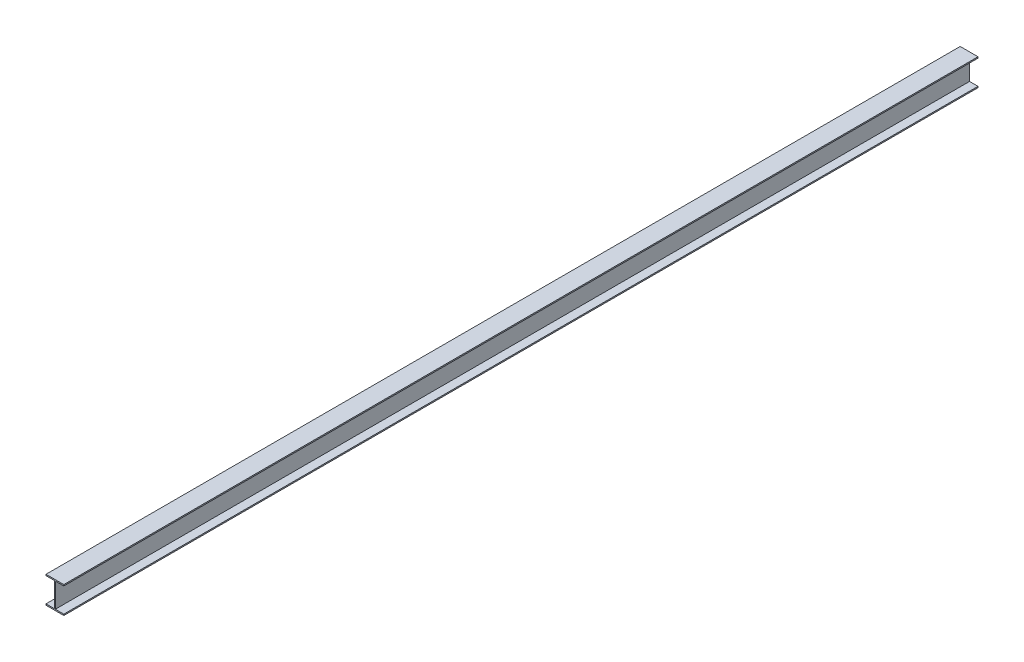
ISO-10303-21;
HEADER;
FILE_DESCRIPTION(('STEP AP214'),'2;1');
FILE_NAME('part.step','',(''),(''),'','','');
FILE_SCHEMA(('AUTOMOTIVE_DESIGN { 1 0 10303 214 1 1 1 1 }'));
ENDSEC;
DATA;
#1=APPLICATION_CONTEXT('core data for automotive mechanical design processes');
#2=APPLICATION_PROTOCOL_DEFINITION('international standard','automotive_design',2000,#1);
#3=PRODUCT_CONTEXT('',#1,'mechanical');
#4=PRODUCT('Part','Part','',(#3));
#5=PRODUCT_RELATED_PRODUCT_CATEGORY('part','',(#4));
#6=PRODUCT_DEFINITION_FORMATION('','',#4);
#7=PRODUCT_DEFINITION_CONTEXT('part definition',#1,'design');
#8=PRODUCT_DEFINITION('design','',#6,#7);
#9=PRODUCT_DEFINITION_SHAPE('','',#8);
#10=(LENGTH_UNIT() NAMED_UNIT(*) SI_UNIT(.MILLI.,.METRE.));
#11=(NAMED_UNIT(*) PLANE_ANGLE_UNIT() SI_UNIT($,.RADIAN.));
#12=(NAMED_UNIT(*) SI_UNIT($,.STERADIAN.) SOLID_ANGLE_UNIT());
#13=UNCERTAINTY_MEASURE_WITH_UNIT(LENGTH_MEASURE(1.E-05),#10,'distance_accuracy_value','');
#14=(GEOMETRIC_REPRESENTATION_CONTEXT(3) GLOBAL_UNCERTAINTY_ASSIGNED_CONTEXT((#13)) GLOBAL_UNIT_ASSIGNED_CONTEXT((#10,
#11,#12)) REPRESENTATION_CONTEXT('',''));
#15=CARTESIAN_POINT('',(0.,0.,0.));
#16=DIRECTION('',(0.,0.,1.));
#17=DIRECTION('',(1.,0.,0.));
#18=AXIS2_PLACEMENT_3D('',#15,#16,#17);
#19=CARTESIAN_POINT('',(101.6,-153.162240532958,5214.4));
#20=DIRECTION('',(0.,1.,0.));
#21=DIRECTION('',(0.,0.,1.));
#22=AXIS2_PLACEMENT_3D('',#19,#20,#21);
#23=PLANE('',#22);
#24=DIRECTION('',(1.,0.,0.));
#25=VECTOR('',#24,1.);
#26=CARTESIAN_POINT('',(101.6,-153.162240532958,4909.6));
#27=LINE('',#26,#25);
#28=CARTESIAN_POINT('',(0.,-153.162240532958,4909.6));
#29=VERTEX_POINT('',#28);
#30=CARTESIAN_POINT('',(101.6,-153.162240532958,4909.6));
#31=VERTEX_POINT('',#30);
#32=EDGE_CURVE('E11',#29,#31,#27,.T.);
#33=ORIENTED_EDGE('',*,*,#32,.F.);
#34=DIRECTION('',(0.,0.,-1.));
#35=VECTOR('',#34,1.);
#36=CARTESIAN_POINT('',(0.,-153.162240532958,5214.4));
#37=LINE('',#36,#35);
#38=CARTESIAN_POINT('',(0.,-153.162240532958,2759.6));
#39=VERTEX_POINT('',#38);
#40=EDGE_CURVE('E217',#29,#39,#37,.T.);
#41=ORIENTED_EDGE('',*,*,#40,.T.);
#42=DIRECTION('',(-1.,0.,0.));
#43=VECTOR('',#42,1.);
#44=CARTESIAN_POINT('',(101.6,-153.162240532958,2759.6));
#45=LINE('',#44,#43);
#46=CARTESIAN_POINT('',(101.6,-153.162240532958,2759.6));
#47=VERTEX_POINT('',#46);
#48=EDGE_CURVE('E182',#47,#39,#45,.T.);
#49=ORIENTED_EDGE('',*,*,#48,.F.);
#50=DIRECTION('',(0.,0.,-1.));
#51=VECTOR('',#50,1.);
#52=CARTESIAN_POINT('',(101.6,-153.162240532958,5214.4));
#53=LINE('',#52,#51);
#54=EDGE_CURVE('E278',#31,#47,#53,.T.);
#55=ORIENTED_EDGE('',*,*,#54,.F.);
#56=EDGE_LOOP('',(#33,#41,#49,#55));
#57=FACE_BOUND('',#56,.T.);
#58=ADVANCED_FACE('F41',(#57),#23,.F.);
#59=DIRECTION('',(-1.,0.,0.));
#60=VECTOR('',#59,1.);
#61=CARTESIAN_POINT('',(101.6,-153.162240532958,304.800000000003));
#62=LINE('',#61,#60);
#63=CARTESIAN_POINT('',(101.6,-153.162240532958,304.800000000005));
#64=VERTEX_POINT('',#63);
#65=CARTESIAN_POINT('',(0.,-153.162240532958,304.800000000005));
#66=VERTEX_POINT('',#65);
#67=EDGE_CURVE('E50',#64,#66,#62,.T.);
#68=ORIENTED_EDGE('',*,*,#67,.F.);
#69=CARTESIAN_POINT('',(101.6,-153.162240532958,2454.8));
#70=VERTEX_POINT('',#69);
#71=EDGE_CURVE('E277',#70,#64,#53,.T.);
#72=ORIENTED_EDGE('',*,*,#71,.F.);
#73=DIRECTION('',(1.,0.,0.));
#74=VECTOR('',#73,1.);
#75=CARTESIAN_POINT('',(101.6,-153.162240532958,2454.8));
#76=LINE('',#75,#74);
#77=CARTESIAN_POINT('',(0.,-153.162240532958,2454.8));
#78=VERTEX_POINT('',#77);
#79=EDGE_CURVE('E179',#78,#70,#76,.T.);
#80=ORIENTED_EDGE('',*,*,#79,.F.);
#81=EDGE_CURVE('E209',#78,#66,#37,.T.);
#82=ORIENTED_EDGE('',*,*,#81,.T.);
#83=EDGE_LOOP('',(#68,#72,#80,#82));
#84=FACE_BOUND('',#83,.T.);
#85=ADVANCED_FACE('F218',(#84),#23,.F.);
#86=CARTESIAN_POINT('',(0.,-153.162240532958,5214.4));
#87=VERTEX_POINT('',#86);
#88=EDGE_CURVE('E220',#87,#29,#37,.T.);
#89=ORIENTED_EDGE('',*,*,#88,.T.);
#90=ORIENTED_EDGE('',*,*,#32,.T.);
#91=CARTESIAN_POINT('',(101.6,-153.162240532958,5214.4));
#92=VERTEX_POINT('',#91);
#93=EDGE_CURVE('E215',#92,#31,#53,.T.);
#94=ORIENTED_EDGE('',*,*,#93,.F.);
#95=DIRECTION('',(1.,0.,0.));
#96=VECTOR('',#95,1.);
#97=CARTESIAN_POINT('',(101.6,-153.162240532958,5214.4));
#98=LINE('',#97,#96);
#99=EDGE_CURVE('E294',#87,#92,#98,.T.);
#100=ORIENTED_EDGE('',*,*,#99,.F.);
#101=EDGE_LOOP('',(#89,#90,#94,#100));
#102=FACE_BOUND('',#101,.T.);
#103=ADVANCED_FACE('F293',(#102),#23,.F.);
#104=CARTESIAN_POINT('',(101.6,-153.162240532958,0.));
#105=VERTEX_POINT('',#104);
#106=EDGE_CURVE('E200',#64,#105,#53,.T.);
#107=ORIENTED_EDGE('',*,*,#106,.F.);
#108=ORIENTED_EDGE('',*,*,#67,.T.);
#109=CARTESIAN_POINT('',(0.,-153.162240532958,0.));
#110=VERTEX_POINT('',#109);
#111=EDGE_CURVE('E198',#66,#110,#37,.T.);
#112=ORIENTED_EDGE('',*,*,#111,.T.);
#113=DIRECTION('',(1.,0.,0.));
#114=VECTOR('',#113,1.);
#115=CARTESIAN_POINT('',(101.6,-153.162240532958,0.));
#116=LINE('',#115,#114);
#117=EDGE_CURVE('E240',#110,#105,#116,.T.);
#118=ORIENTED_EDGE('',*,*,#117,.T.);
#119=EDGE_LOOP('',(#107,#108,#112,#118));
#120=FACE_BOUND('',#119,.T.);
#121=ADVANCED_FACE('F196',(#120),#23,.F.);
#122=CARTESIAN_POINT('',(0.,-7.11224053295814,5214.4));
#123=DIRECTION('',(1.,0.,0.));
#124=DIRECTION('',(0.,0.,-1.));
#125=AXIS2_PLACEMENT_3D('',#122,#123,#124);
#126=PLANE('',#125);
#127=DIRECTION('',(0.,-1.,0.));
#128=VECTOR('',#127,1.);
#129=CARTESIAN_POINT('',(0.,-7.11224053295814,0.));
#130=LINE('',#129,#128);
#131=CARTESIAN_POINT('',(0.,-0.000240532958142959,0.));
#132=VERTEX_POINT('',#131);
#133=CARTESIAN_POINT('',(0.,-7.11224053295814,0.));
#134=VERTEX_POINT('',#133);
#135=EDGE_CURVE('E178',#132,#134,#130,.T.);
#136=ORIENTED_EDGE('',*,*,#135,.T.);
#137=DIRECTION('',(0.,0.,-1.));
#138=VECTOR('',#137,1.);
#139=CARTESIAN_POINT('',(0.,-7.11224053295814,5214.4));
#140=LINE('',#139,#138);
#141=CARTESIAN_POINT('',(0.,-7.11224053295814,5214.4));
#142=VERTEX_POINT('',#141);
#143=EDGE_CURVE('E159',#142,#134,#140,.T.);
#144=ORIENTED_EDGE('',*,*,#143,.F.);
#145=DIRECTION('',(0.,-1.,0.));
#146=VECTOR('',#145,1.);
#147=CARTESIAN_POINT('',(0.,-7.11224053295814,5214.4));
#148=LINE('',#147,#146);
#149=CARTESIAN_POINT('',(0.,-0.000240532958142959,5214.4));
#150=VERTEX_POINT('',#149);
#151=EDGE_CURVE('E166',#150,#142,#148,.T.);
#152=ORIENTED_EDGE('',*,*,#151,.F.);
#153=DIRECTION('',(0.,0.,-1.));
#154=VECTOR('',#153,1.);
#155=CARTESIAN_POINT('',(0.,-0.000240532958142959,5214.4));
#156=LINE('',#155,#154);
#157=EDGE_CURVE('E258',#150,#132,#156,.T.);
#158=ORIENTED_EDGE('',*,*,#157,.T.);
#159=EDGE_LOOP('',(#136,#144,#152,#158));
#160=FACE_BOUND('',#159,.T.);
#161=ADVANCED_FACE('F43',(#160),#126,.F.);
#162=CARTESIAN_POINT('',(47.5660357142857,-7.11224053295814,5214.4));
#163=DIRECTION('',(0.,1.,0.));
#164=DIRECTION('',(-1.,0.,0.));
#165=AXIS2_PLACEMENT_3D('',#162,#163,#164);
#166=PLANE('',#165);
#167=DIRECTION('',(1.,0.,0.));
#168=VECTOR('',#167,1.);
#169=CARTESIAN_POINT('',(47.5660357142857,-7.11224053295814,0.));
#170=LINE('',#169,#168);
#171=CARTESIAN_POINT('',(47.5660357142857,-7.11224053295814,0.));
#172=VERTEX_POINT('',#171);
#173=EDGE_CURVE('E242',#134,#172,#170,.T.);
#174=ORIENTED_EDGE('',*,*,#173,.T.);
#175=DIRECTION('',(0.,0.,-1.));
#176=VECTOR('',#175,1.);
#177=CARTESIAN_POINT('',(47.5660357142857,-7.11224053295814,5214.4));
#178=LINE('',#177,#176);
#179=CARTESIAN_POINT('',(47.5660357142857,-7.11224053295814,5214.4));
#180=VERTEX_POINT('',#179);
#181=EDGE_CURVE('E162',#180,#172,#178,.T.);
#182=ORIENTED_EDGE('',*,*,#181,.F.);
#183=DIRECTION('',(1.,0.,0.));
#184=VECTOR('',#183,1.);
#185=CARTESIAN_POINT('',(47.5660357142857,-7.11224053295814,5214.4));
#186=LINE('',#185,#184);
#187=EDGE_CURVE('E155',#142,#180,#186,.T.);
#188=ORIENTED_EDGE('',*,*,#187,.F.);
#189=ORIENTED_EDGE('',*,*,#143,.T.);
#190=EDGE_LOOP('',(#174,#182,#188,#189));
#191=FACE_BOUND('',#190,.T.);
#192=ADVANCED_FACE('F157',(#191),#166,.F.);
#193=CARTESIAN_POINT('',(47.5660357142857,-146.050240532958,5214.4));
#194=DIRECTION('',(1.,0.,0.));
#195=DIRECTION('',(0.,0.,-1.));
#196=AXIS2_PLACEMENT_3D('',#193,#194,#195);
#197=PLANE('',#196);
#198=DIRECTION('',(0.,-1.,0.));
#199=VECTOR('',#198,1.);
#200=CARTESIAN_POINT('',(47.5660357142857,-146.050240532958,0.));
#201=LINE('',#200,#199);
#202=CARTESIAN_POINT('',(47.5660357142857,-146.050240532958,0.));
#203=VERTEX_POINT('',#202);
#204=EDGE_CURVE('E238',#172,#203,#201,.T.);
#205=ORIENTED_EDGE('',*,*,#204,.T.);
#206=DIRECTION('',(0.,0.,-1.));
#207=VECTOR('',#206,1.);
#208=CARTESIAN_POINT('',(47.5660357142857,-146.050240532958,5214.4));
#209=LINE('',#208,#207);
#210=CARTESIAN_POINT('',(47.5660357142857,-146.050240532958,5214.4));
#211=VERTEX_POINT('',#210);
#212=EDGE_CURVE('E184',#211,#203,#209,.T.);
#213=ORIENTED_EDGE('',*,*,#212,.F.);
#214=DIRECTION('',(0.,-1.,0.));
#215=VECTOR('',#214,1.);
#216=CARTESIAN_POINT('',(47.5660357142857,-146.050240532958,5214.4));
#217=LINE('',#216,#215);
#218=EDGE_CURVE('E165',#180,#211,#217,.T.);
#219=ORIENTED_EDGE('',*,*,#218,.F.);
#220=ORIENTED_EDGE('',*,*,#181,.T.);
#221=EDGE_LOOP('',(#205,#213,#219,#220));
#222=FACE_BOUND('',#221,.T.);
#223=ADVANCED_FACE('F312',(#222),#197,.F.);
#224=CARTESIAN_POINT('',(0.,-146.050240532958,5214.4));
#225=DIRECTION('',(0.,-1.,0.));
#226=DIRECTION('',(1.,0.,0.));
#227=AXIS2_PLACEMENT_3D('',#224,#225,#226);
#228=PLANE('',#227);
#229=DIRECTION('',(-1.,0.,0.));
#230=VECTOR('',#229,1.);
#231=CARTESIAN_POINT('',(0.,-146.050240532958,0.));
#232=LINE('',#231,#230);
#233=CARTESIAN_POINT('',(0.,-146.050240532958,0.));
#234=VERTEX_POINT('',#233);
#235=EDGE_CURVE('E232',#203,#234,#232,.T.);
#236=ORIENTED_EDGE('',*,*,#235,.T.);
#237=DIRECTION('',(0.,0.,-1.));
#238=VECTOR('',#237,1.);
#239=CARTESIAN_POINT('',(0.,-146.050240532958,5214.4));
#240=LINE('',#239,#238);
#241=CARTESIAN_POINT('',(0.,-146.050240532958,5214.4));
#242=VERTEX_POINT('',#241);
#243=EDGE_CURVE('E223',#242,#234,#240,.T.);
#244=ORIENTED_EDGE('',*,*,#243,.F.);
#245=DIRECTION('',(-1.,0.,0.));
#246=VECTOR('',#245,1.);
#247=CARTESIAN_POINT('',(0.,-146.050240532958,5214.4));
#248=LINE('',#247,#246);
#249=EDGE_CURVE('E233',#211,#242,#248,.T.);
#250=ORIENTED_EDGE('',*,*,#249,.F.);
#251=ORIENTED_EDGE('',*,*,#212,.T.);
#252=EDGE_LOOP('',(#236,#244,#250,#251));
#253=FACE_BOUND('',#252,.T.);
#254=ADVANCED_FACE('F230',(#253),#228,.F.);
#255=CARTESIAN_POINT('',(0.,-153.162240532958,5214.4));
#256=DIRECTION('',(1.,0.,0.));
#257=DIRECTION('',(0.,0.,-1.));
#258=AXIS2_PLACEMENT_3D('',#255,#256,#257);
#259=PLANE('',#258);
#260=DIRECTION('',(0.,-1.,0.));
#261=VECTOR('',#260,1.);
#262=CARTESIAN_POINT('',(0.,-153.162240532958,0.));
#263=LINE('',#262,#261);
#264=EDGE_CURVE('E213',#234,#110,#263,.T.);
#265=ORIENTED_EDGE('',*,*,#264,.T.);
#266=ORIENTED_EDGE('',*,*,#111,.F.);
#267=ORIENTED_EDGE('',*,*,#81,.F.);
#268=EDGE_CURVE('E219',#39,#78,#37,.T.);
#269=ORIENTED_EDGE('',*,*,#268,.F.);
#270=ORIENTED_EDGE('',*,*,#40,.F.);
#271=ORIENTED_EDGE('',*,*,#88,.F.);
#272=DIRECTION('',(0.,-1.,0.));
#273=VECTOR('',#272,1.);
#274=CARTESIAN_POINT('',(0.,-153.162240532958,5214.4));
#275=LINE('',#274,#273);
#276=EDGE_CURVE('E297',#242,#87,#275,.T.);
#277=ORIENTED_EDGE('',*,*,#276,.F.);
#278=ORIENTED_EDGE('',*,*,#243,.T.);
#279=EDGE_LOOP('',(#265,#266,#267,#269,#270,#271,#277,#278));
#280=FACE_BOUND('',#279,.T.);
#281=ADVANCED_FACE('F207',(#280),#259,.F.);
#282=CARTESIAN_POINT('',(101.6,-153.162240532958,2607.2));
#283=VERTEX_POINT('',#282);
#284=EDGE_CURVE('E281',#47,#283,#53,.T.);
#285=ORIENTED_EDGE('',*,*,#284,.F.);
#286=ORIENTED_EDGE('',*,*,#48,.T.);
#287=ORIENTED_EDGE('',*,*,#268,.T.);
#288=ORIENTED_EDGE('',*,*,#79,.T.);
#289=EDGE_CURVE('E280',#283,#70,#53,.T.);
#290=ORIENTED_EDGE('',*,*,#289,.F.);
#291=EDGE_LOOP('',(#285,#286,#287,#288,#290));
#292=FACE_BOUND('',#291,.T.);
#293=ADVANCED_FACE('F289',(#292),#23,.F.);
#294=CARTESIAN_POINT('',(101.6,-146.050240532958,5214.4));
#295=DIRECTION('',(-1.,0.,0.));
#296=DIRECTION('',(0.,0.,1.));
#297=AXIS2_PLACEMENT_3D('',#294,#295,#296);
#298=PLANE('',#297);
#299=DIRECTION('',(0.,1.,0.));
#300=VECTOR('',#299,1.);
#301=CARTESIAN_POINT('',(101.6,-146.050240532958,0.));
#302=LINE('',#301,#300);
#303=CARTESIAN_POINT('',(101.6,-146.050240532958,0.));
#304=VERTEX_POINT('',#303);
#305=EDGE_CURVE('E247',#105,#304,#302,.T.);
#306=ORIENTED_EDGE('',*,*,#305,.T.);
#307=DIRECTION('',(0.,0.,-1.));
#308=VECTOR('',#307,1.);
#309=CARTESIAN_POINT('',(101.6,-146.050240532958,5214.4));
#310=LINE('',#309,#308);
#311=CARTESIAN_POINT('',(101.6,-146.050240532958,5214.4));
#312=VERTEX_POINT('',#311);
#313=EDGE_CURVE('E271',#312,#304,#310,.T.);
#314=ORIENTED_EDGE('',*,*,#313,.F.);
#315=DIRECTION('',(0.,1.,0.));
#316=VECTOR('',#315,1.);
#317=CARTESIAN_POINT('',(101.6,-146.050240532958,5214.4));
#318=LINE('',#317,#316);
#319=EDGE_CURVE('E296',#92,#312,#318,.T.);
#320=ORIENTED_EDGE('',*,*,#319,.F.);
#321=ORIENTED_EDGE('',*,*,#93,.T.);
#322=ORIENTED_EDGE('',*,*,#54,.T.);
#323=ORIENTED_EDGE('',*,*,#284,.T.);
#324=ORIENTED_EDGE('',*,*,#289,.T.);
#325=ORIENTED_EDGE('',*,*,#71,.T.);
#326=ORIENTED_EDGE('',*,*,#106,.T.);
#327=EDGE_LOOP('',(#306,#314,#320,#321,#322,#323,#324,#325,#326));
#328=FACE_BOUND('',#327,.T.);
#329=ADVANCED_FACE('F287',(#328),#298,.F.);
#330=CARTESIAN_POINT('',(53.4080357142857,-146.050240532958,5214.4));
#331=DIRECTION('',(0.,-1.,0.));
#332=DIRECTION('',(1.,0.,0.));
#333=AXIS2_PLACEMENT_3D('',#330,#331,#332);
#334=PLANE('',#333);
#335=DIRECTION('',(-1.,0.,0.));
#336=VECTOR('',#335,1.);
#337=CARTESIAN_POINT('',(53.4080357142857,-146.050240532958,0.));
#338=LINE('',#337,#336);
#339=CARTESIAN_POINT('',(53.4080357142857,-146.050240532958,0.));
#340=VERTEX_POINT('',#339);
#341=EDGE_CURVE('E249',#304,#340,#338,.T.);
#342=ORIENTED_EDGE('',*,*,#341,.T.);
#343=DIRECTION('',(0.,0.,-1.));
#344=VECTOR('',#343,1.);
#345=CARTESIAN_POINT('',(53.4080357142857,-146.050240532958,5214.4));
#346=LINE('',#345,#344);
#347=CARTESIAN_POINT('',(53.4080357142857,-146.050240532958,5214.4));
#348=VERTEX_POINT('',#347);
#349=EDGE_CURVE('E269',#348,#340,#346,.T.);
#350=ORIENTED_EDGE('',*,*,#349,.F.);
#351=DIRECTION('',(-1.,0.,0.));
#352=VECTOR('',#351,1.);
#353=CARTESIAN_POINT('',(53.4080357142857,-146.050240532958,5214.4));
#354=LINE('',#353,#352);
#355=EDGE_CURVE('E299',#312,#348,#354,.T.);
#356=ORIENTED_EDGE('',*,*,#355,.F.);
#357=ORIENTED_EDGE('',*,*,#313,.T.);
#358=EDGE_LOOP('',(#342,#350,#356,#357));
#359=FACE_BOUND('',#358,.T.);
#360=ADVANCED_FACE('F333',(#359),#334,.F.);
#361=CARTESIAN_POINT('',(53.4080357142857,-7.11224053295815,5214.4));
#362=DIRECTION('',(-1.,0.,0.));
#363=DIRECTION('',(0.,-1.,0.));
#364=AXIS2_PLACEMENT_3D('',#361,#362,#363);
#365=PLANE('',#364);
#366=DIRECTION('',(0.,1.,0.));
#367=VECTOR('',#366,1.);
#368=CARTESIAN_POINT('',(53.4080357142857,-7.11224053295815,0.));
#369=LINE('',#368,#367);
#370=CARTESIAN_POINT('',(53.4080357142857,-7.11224053295815,0.));
#371=VERTEX_POINT('',#370);
#372=EDGE_CURVE('E251',#340,#371,#369,.T.);
#373=ORIENTED_EDGE('',*,*,#372,.T.);
#374=DIRECTION('',(0.,0.,-1.));
#375=VECTOR('',#374,1.);
#376=CARTESIAN_POINT('',(53.4080357142857,-7.11224053295815,5214.4));
#377=LINE('',#376,#375);
#378=CARTESIAN_POINT('',(53.4080357142857,-7.11224053295815,5214.4));
#379=VERTEX_POINT('',#378);
#380=EDGE_CURVE('E266',#379,#371,#377,.T.);
#381=ORIENTED_EDGE('',*,*,#380,.F.);
#382=DIRECTION('',(0.,1.,0.));
#383=VECTOR('',#382,1.);
#384=CARTESIAN_POINT('',(53.4080357142857,-7.11224053295815,5214.4));
#385=LINE('',#384,#383);
#386=EDGE_CURVE('E305',#348,#379,#385,.T.);
#387=ORIENTED_EDGE('',*,*,#386,.F.);
#388=ORIENTED_EDGE('',*,*,#349,.T.);
#389=EDGE_LOOP('',(#373,#381,#387,#388));
#390=FACE_BOUND('',#389,.T.);
#391=ADVANCED_FACE('F380',(#390),#365,.F.);
#392=CARTESIAN_POINT('',(101.6,-7.11224053295814,5214.4));
#393=DIRECTION('',(0.,1.,0.));
#394=DIRECTION('',(-1.,0.,0.));
#395=AXIS2_PLACEMENT_3D('',#392,#393,#394);
#396=PLANE('',#395);
#397=DIRECTION('',(1.,0.,0.));
#398=VECTOR('',#397,1.);
#399=CARTESIAN_POINT('',(101.6,-7.11224053295814,0.));
#400=LINE('',#399,#398);
#401=CARTESIAN_POINT('',(101.6,-7.11224053295814,0.));
#402=VERTEX_POINT('',#401);
#403=EDGE_CURVE('E253',#371,#402,#400,.T.);
#404=ORIENTED_EDGE('',*,*,#403,.T.);
#405=DIRECTION('',(0.,0.,-1.));
#406=VECTOR('',#405,1.);
#407=CARTESIAN_POINT('',(101.6,-7.11224053295814,5214.4));
#408=LINE('',#407,#406);
#409=CARTESIAN_POINT('',(101.6,-7.11224053295814,5214.4));
#410=VERTEX_POINT('',#409);
#411=EDGE_CURVE('E263',#410,#402,#408,.T.);
#412=ORIENTED_EDGE('',*,*,#411,.F.);
#413=DIRECTION('',(1.,0.,0.));
#414=VECTOR('',#413,1.);
#415=CARTESIAN_POINT('',(101.6,-7.11224053295814,5214.4));
#416=LINE('',#415,#414);
#417=EDGE_CURVE('E307',#379,#410,#416,.T.);
#418=ORIENTED_EDGE('',*,*,#417,.F.);
#419=ORIENTED_EDGE('',*,*,#380,.T.);
#420=EDGE_LOOP('',(#404,#412,#418,#419));
#421=FACE_BOUND('',#420,.T.);
#422=ADVANCED_FACE('F387',(#421),#396,.F.);
#423=CARTESIAN_POINT('',(101.6,-0.000240532958130516,5214.4));
#424=DIRECTION('',(-1.,0.,0.));
#425=DIRECTION('',(0.,0.,1.));
#426=AXIS2_PLACEMENT_3D('',#423,#424,#425);
#427=PLANE('',#426);
#428=DIRECTION('',(0.,1.,0.));
#429=VECTOR('',#428,1.);
#430=CARTESIAN_POINT('',(101.6,-0.000240532958130516,0.));
#431=LINE('',#430,#429);
#432=CARTESIAN_POINT('',(101.6,-0.000240532958130516,0.));
#433=VERTEX_POINT('',#432);
#434=EDGE_CURVE('E255',#402,#433,#431,.T.);
#435=ORIENTED_EDGE('',*,*,#434,.T.);
#436=DIRECTION('',(0.,0.,-1.));
#437=VECTOR('',#436,1.);
#438=CARTESIAN_POINT('',(101.6,-0.000240532958130516,5214.4));
#439=LINE('',#438,#437);
#440=CARTESIAN_POINT('',(101.6,-0.000240532958130516,5214.4));
#441=VERTEX_POINT('',#440);
#442=EDGE_CURVE('E260',#441,#433,#439,.T.);
#443=ORIENTED_EDGE('',*,*,#442,.F.);
#444=DIRECTION('',(0.,1.,0.));
#445=VECTOR('',#444,1.);
#446=CARTESIAN_POINT('',(101.6,-0.000240532958130516,5214.4));
#447=LINE('',#446,#445);
#448=EDGE_CURVE('E309',#410,#441,#447,.T.);
#449=ORIENTED_EDGE('',*,*,#448,.F.);
#450=ORIENTED_EDGE('',*,*,#411,.T.);
#451=EDGE_LOOP('',(#435,#443,#449,#450));
#452=FACE_BOUND('',#451,.T.);
#453=ADVANCED_FACE('F395',(#452),#427,.F.);
#454=CARTESIAN_POINT('',(0.,-0.000240532958142959,5214.4));
#455=DIRECTION('',(0.,-1.,0.));
#456=DIRECTION('',(1.,0.,0.));
#457=AXIS2_PLACEMENT_3D('',#454,#455,#456);
#458=PLANE('',#457);
#459=DIRECTION('',(-1.,0.,0.));
#460=VECTOR('',#459,1.);
#461=CARTESIAN_POINT('',(0.,-0.000240532958142959,0.));
#462=LINE('',#461,#460);
#463=EDGE_CURVE('E175',#433,#132,#462,.T.);
#464=ORIENTED_EDGE('',*,*,#463,.T.);
#465=ORIENTED_EDGE('',*,*,#157,.F.);
#466=DIRECTION('',(-1.,0.,0.));
#467=VECTOR('',#466,1.);
#468=CARTESIAN_POINT('',(0.,-0.000240532958142959,5214.4));
#469=LINE('',#468,#467);
#470=EDGE_CURVE('E171',#441,#150,#469,.T.);
#471=ORIENTED_EDGE('',*,*,#470,.F.);
#472=ORIENTED_EDGE('',*,*,#442,.T.);
#473=EDGE_LOOP('',(#464,#465,#471,#472));
#474=FACE_BOUND('',#473,.T.);
#475=ADVANCED_FACE('F403',(#474),#458,.F.);
#476=CARTESIAN_POINT('',(0.,0.,5214.4));
#477=DIRECTION('',(0.,0.,-1.));
#478=DIRECTION('',(-1.,0.,0.));
#479=AXIS2_PLACEMENT_3D('',#476,#477,#478);
#480=PLANE('',#479);
#481=ORIENTED_EDGE('',*,*,#151,.T.);
#482=ORIENTED_EDGE('',*,*,#187,.T.);
#483=ORIENTED_EDGE('',*,*,#218,.T.);
#484=ORIENTED_EDGE('',*,*,#249,.T.);
#485=ORIENTED_EDGE('',*,*,#276,.T.);
#486=ORIENTED_EDGE('',*,*,#99,.T.);
#487=ORIENTED_EDGE('',*,*,#319,.T.);
#488=ORIENTED_EDGE('',*,*,#355,.T.);
#489=ORIENTED_EDGE('',*,*,#386,.T.);
#490=ORIENTED_EDGE('',*,*,#417,.T.);
#491=ORIENTED_EDGE('',*,*,#448,.T.);
#492=ORIENTED_EDGE('',*,*,#470,.T.);
#493=EDGE_LOOP('',(#481,#482,#483,#484,#485,#486,#487,#488,#489,#490,#491,#492));
#494=FACE_BOUND('',#493,.T.);
#495=ADVANCED_FACE('F169',(#494),#480,.F.);
#496=CARTESIAN_POINT('',(0.,0.,0.));
#497=DIRECTION('',(0.,0.,-1.));
#498=DIRECTION('',(-1.,0.,0.));
#499=AXIS2_PLACEMENT_3D('',#496,#497,#498);
#500=PLANE('',#499);
#501=ORIENTED_EDGE('',*,*,#135,.F.);
#502=ORIENTED_EDGE('',*,*,#463,.F.);
#503=ORIENTED_EDGE('',*,*,#434,.F.);
#504=ORIENTED_EDGE('',*,*,#403,.F.);
#505=ORIENTED_EDGE('',*,*,#372,.F.);
#506=ORIENTED_EDGE('',*,*,#341,.F.);
#507=ORIENTED_EDGE('',*,*,#305,.F.);
#508=ORIENTED_EDGE('',*,*,#117,.F.);
#509=ORIENTED_EDGE('',*,*,#264,.F.);
#510=ORIENTED_EDGE('',*,*,#235,.F.);
#511=ORIENTED_EDGE('',*,*,#204,.F.);
#512=ORIENTED_EDGE('',*,*,#173,.F.);
#513=EDGE_LOOP('',(#501,#502,#503,#504,#505,#506,#507,#508,#509,#510,#511,#512));
#514=FACE_BOUND('',#513,.T.);
#515=ADVANCED_FACE('F237',(#514),#500,.T.);
#516=CLOSED_SHELL('',(#58,#85,#103,#121,#161,#192,#223,#254,#281,#293,#329,#360,#391,#422,#453,
#475,#495,#515));
#517=MANIFOLD_SOLID_BREP('B2',#516);
#518=ADVANCED_BREP_SHAPE_REPRESENTATION('',(#18,#517),#14);
#519=SHAPE_DEFINITION_REPRESENTATION(#9,#518);
ENDSEC;
END-ISO-10303-21;
